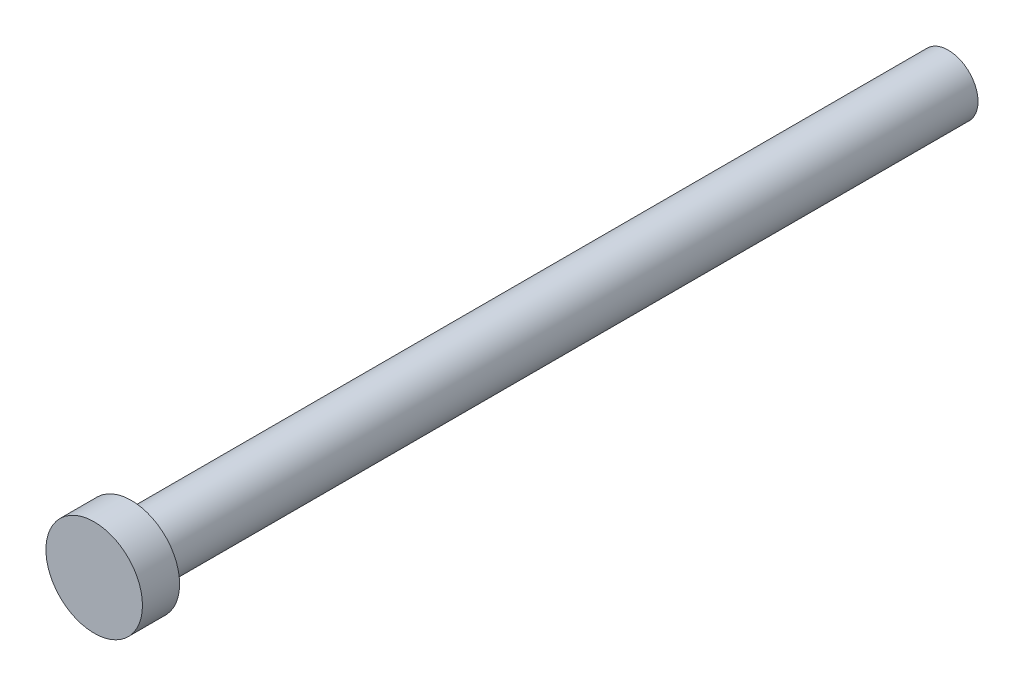
ISO-10303-21;
HEADER;
FILE_DESCRIPTION(('STEP AP214'),'2;1');
FILE_NAME('part.step','',(''),(''),'','','');
FILE_SCHEMA(('AUTOMOTIVE_DESIGN { 1 0 10303 214 1 1 1 1 }'));
ENDSEC;
DATA;
#1=APPLICATION_CONTEXT('core data for automotive mechanical design processes');
#2=APPLICATION_PROTOCOL_DEFINITION('international standard','automotive_design',2000,#1);
#3=PRODUCT_CONTEXT('',#1,'mechanical');
#4=PRODUCT('Part','Part','',(#3));
#5=PRODUCT_RELATED_PRODUCT_CATEGORY('part','',(#4));
#6=PRODUCT_DEFINITION_FORMATION('','',#4);
#7=PRODUCT_DEFINITION_CONTEXT('part definition',#1,'design');
#8=PRODUCT_DEFINITION('design','',#6,#7);
#9=PRODUCT_DEFINITION_SHAPE('','',#8);
#10=(LENGTH_UNIT() NAMED_UNIT(*) SI_UNIT(.MILLI.,.METRE.));
#11=(NAMED_UNIT(*) PLANE_ANGLE_UNIT() SI_UNIT($,.RADIAN.));
#12=(NAMED_UNIT(*) SI_UNIT($,.STERADIAN.) SOLID_ANGLE_UNIT());
#13=UNCERTAINTY_MEASURE_WITH_UNIT(LENGTH_MEASURE(1.E-05),#10,'distance_accuracy_value','');
#14=(GEOMETRIC_REPRESENTATION_CONTEXT(3) GLOBAL_UNCERTAINTY_ASSIGNED_CONTEXT((#13)) GLOBAL_UNIT_ASSIGNED_CONTEXT((#10,
#11,#12)) REPRESENTATION_CONTEXT('',''));
#15=CARTESIAN_POINT('',(0.,0.,0.));
#16=DIRECTION('',(0.,0.,1.));
#17=DIRECTION('',(1.,0.,0.));
#18=AXIS2_PLACEMENT_3D('',#15,#16,#17);
#19=CARTESIAN_POINT('',(0.,0.,110.));
#20=DIRECTION('',(0.,0.,-1.));
#21=DIRECTION('',(-1.,0.,0.));
#22=AXIS2_PLACEMENT_3D('',#19,#20,#21);
#23=CYLINDRICAL_SURFACE('',#22,4.);
#24=CARTESIAN_POINT('',(0.,0.,110.));
#25=DIRECTION('',(0.,0.,1.));
#26=DIRECTION('',(1.,0.,0.));
#27=AXIS2_PLACEMENT_3D('',#24,#25,#26);
#28=CIRCLE('',#27,4.);
#29=CARTESIAN_POINT('',(4.,0.,110.));
#30=VERTEX_POINT('',#29);
#31=EDGE_CURVE('E10',#30,#30,#28,.T.);
#32=ORIENTED_EDGE('',*,*,#31,.F.);
#33=EDGE_LOOP('',(#32));
#34=FACE_BOUND('',#33,.T.);
#35=CARTESIAN_POINT('',(0.,0.,0.));
#36=DIRECTION('',(0.,0.,1.));
#37=DIRECTION('',(1.,0.,0.));
#38=AXIS2_PLACEMENT_3D('',#35,#36,#37);
#39=CIRCLE('',#38,4.);
#40=CARTESIAN_POINT('',(4.,0.,0.));
#41=VERTEX_POINT('',#40);
#42=EDGE_CURVE('E42',#41,#41,#39,.T.);
#43=ORIENTED_EDGE('',*,*,#42,.T.);
#44=EDGE_LOOP('',(#43));
#45=FACE_BOUND('',#44,.T.);
#46=ADVANCED_FACE('F39',(#34,#45),#23,.T.);
#47=CARTESIAN_POINT('',(0.,0.,0.));
#48=DIRECTION('',(0.,0.,1.));
#49=DIRECTION('',(1.,0.,0.));
#50=AXIS2_PLACEMENT_3D('',#47,#48,#49);
#51=PLANE('',#50);
#52=ORIENTED_EDGE('',*,*,#42,.F.);
#53=EDGE_LOOP('',(#52));
#54=FACE_BOUND('',#53,.T.);
#55=ADVANCED_FACE('F66',(#54),#51,.F.);
#56=CARTESIAN_POINT('',(0.,0.,115.));
#57=DIRECTION('',(0.,0.,-1.));
#58=DIRECTION('',(-1.,0.,0.));
#59=AXIS2_PLACEMENT_3D('',#56,#57,#58);
#60=CYLINDRICAL_SURFACE('',#59,6.5);
#61=CARTESIAN_POINT('',(0.,0.,115.));
#62=DIRECTION('',(0.,0.,1.));
#63=DIRECTION('',(1.,0.,0.));
#64=AXIS2_PLACEMENT_3D('',#61,#62,#63);
#65=CIRCLE('',#64,6.5);
#66=CARTESIAN_POINT('',(6.5,0.,115.));
#67=VERTEX_POINT('',#66);
#68=EDGE_CURVE('E51',#67,#67,#65,.T.);
#69=ORIENTED_EDGE('',*,*,#68,.F.);
#70=EDGE_LOOP('',(#69));
#71=FACE_BOUND('',#70,.T.);
#72=CARTESIAN_POINT('',(0.,0.,110.));
#73=DIRECTION('',(0.,0.,1.));
#74=DIRECTION('',(1.,0.,0.));
#75=AXIS2_PLACEMENT_3D('',#72,#73,#74);
#76=CIRCLE('',#75,6.5);
#77=CARTESIAN_POINT('',(6.5,0.,110.));
#78=VERTEX_POINT('',#77);
#79=EDGE_CURVE('E53',#78,#78,#76,.T.);
#80=ORIENTED_EDGE('',*,*,#79,.T.);
#81=EDGE_LOOP('',(#80));
#82=FACE_BOUND('',#81,.T.);
#83=ADVANCED_FACE('F63',(#71,#82),#60,.T.);
#84=CARTESIAN_POINT('',(0.,0.,115.));
#85=DIRECTION('',(0.,0.,1.));
#86=DIRECTION('',(1.,0.,0.));
#87=AXIS2_PLACEMENT_3D('',#84,#85,#86);
#88=PLANE('',#87);
#89=ORIENTED_EDGE('',*,*,#68,.T.);
#90=EDGE_LOOP('',(#89));
#91=FACE_BOUND('',#90,.T.);
#92=ADVANCED_FACE('F61',(#91),#88,.T.);
#93=CARTESIAN_POINT('',(0.,0.,110.));
#94=DIRECTION('',(0.,0.,1.));
#95=DIRECTION('',(1.,0.,0.));
#96=AXIS2_PLACEMENT_3D('',#93,#94,#95);
#97=PLANE('',#96);
#98=ORIENTED_EDGE('',*,*,#31,.T.);
#99=EDGE_LOOP('',(#98));
#100=FACE_BOUND('',#99,.T.);
#101=ORIENTED_EDGE('',*,*,#79,.F.);
#102=EDGE_LOOP('',(#101));
#103=FACE_BOUND('',#102,.T.);
#104=ADVANCED_FACE('F70',(#100,#103),#97,.F.);
#105=CLOSED_SHELL('',(#46,#55,#83,#92,#104));
#106=MANIFOLD_SOLID_BREP('B2',#105);
#107=ADVANCED_BREP_SHAPE_REPRESENTATION('',(#18,#106),#14);
#108=SHAPE_DEFINITION_REPRESENTATION(#9,#107);
ENDSEC;
END-ISO-10303-21;
